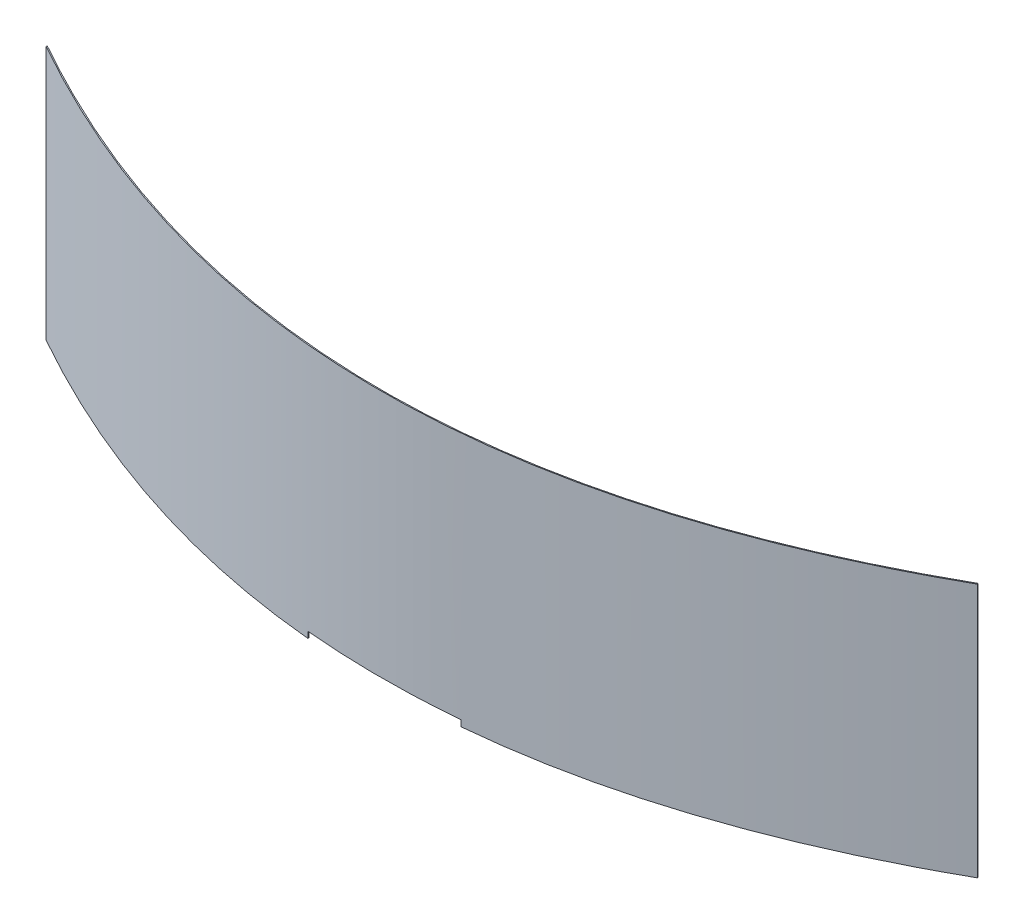
ISO-10303-21;
HEADER;
FILE_DESCRIPTION(('STEP AP214'),'2;1');
FILE_NAME('part.step','',(''),(''),'','','');
FILE_SCHEMA(('AUTOMOTIVE_DESIGN { 1 0 10303 214 1 1 1 1 }'));
ENDSEC;
DATA;
#1=APPLICATION_CONTEXT('core data for automotive mechanical design processes');
#2=APPLICATION_PROTOCOL_DEFINITION('international standard','automotive_design',2000,#1);
#3=PRODUCT_CONTEXT('',#1,'mechanical');
#4=PRODUCT('Part','Part','',(#3));
#5=PRODUCT_RELATED_PRODUCT_CATEGORY('part','',(#4));
#6=PRODUCT_DEFINITION_FORMATION('','',#4);
#7=PRODUCT_DEFINITION_CONTEXT('part definition',#1,'design');
#8=PRODUCT_DEFINITION('design','',#6,#7);
#9=PRODUCT_DEFINITION_SHAPE('','',#8);
#10=(LENGTH_UNIT() NAMED_UNIT(*) SI_UNIT(.MILLI.,.METRE.));
#11=(NAMED_UNIT(*) PLANE_ANGLE_UNIT() SI_UNIT($,.RADIAN.));
#12=(NAMED_UNIT(*) SI_UNIT($,.STERADIAN.) SOLID_ANGLE_UNIT());
#13=UNCERTAINTY_MEASURE_WITH_UNIT(LENGTH_MEASURE(1.E-05),#10,'distance_accuracy_value','');
#14=(GEOMETRIC_REPRESENTATION_CONTEXT(3) GLOBAL_UNCERTAINTY_ASSIGNED_CONTEXT((#13)) GLOBAL_UNIT_ASSIGNED_CONTEXT((#10,
#11,#12)) REPRESENTATION_CONTEXT('',''));
#15=CARTESIAN_POINT('',(0.,0.,0.));
#16=DIRECTION('',(0.,0.,1.));
#17=DIRECTION('',(1.,0.,0.));
#18=AXIS2_PLACEMENT_3D('',#15,#16,#17);
#19=CARTESIAN_POINT('',(28284.2712474619,123.,-999800.));
#20=CARTESIAN_POINT('',(0.,123.,1000200.));
#21=CARTESIAN_POINT('',(-28284.2712474619,123.,-999800.));
#22=B_SPLINE_CURVE_WITH_KNOTS('',2,(#19,#20,#21),.UNSPECIFIED.,.F.,.F.,(3,3),(0.,1.),.UNSPECIFIED.);
#23=DIRECTION('',(0.,-1.,0.));
#24=VECTOR('',#23,1.);
#25=SURFACE_OF_LINEAR_EXTRUSION('',#22,#24);
#26=DIRECTION('',(0.,-1.,0.));
#27=VECTOR('',#26,1.);
#28=CARTESIAN_POINT('',(-36.9999999999981,123.,198.288749999989));
#29=LINE('',#28,#27);
#30=CARTESIAN_POINT('',(-37.,0.,198.288749999989));
#31=VERTEX_POINT('',#30);
#32=CARTESIAN_POINT('',(-37.,3.00000000000002,198.288749999989));
#33=VERTEX_POINT('',#32);
#34=EDGE_CURVE('E190',#31,#33,#29,.F.);
#35=ORIENTED_EDGE('',*,*,#34,.F.);
#36=CARTESIAN_POINT('',(28284.2712474619,0.,-999800.));
#37=CARTESIAN_POINT('',(0.,0.,1000200.));
#38=CARTESIAN_POINT('',(-28284.2712474619,0.,-999800.));
#39=B_SPLINE_CURVE_WITH_KNOTS('',2,(#36,#37,#38),.UNSPECIFIED.,.F.,.F.,(3,3),(0.,1.),.UNSPECIFIED.);
#40=CARTESIAN_POINT('',(-225.000000000003,0.,136.718749999988));
#41=VERTEX_POINT('',#40);
#42=EDGE_CURVE('E175',#31,#41,#39,.T.);
#43=ORIENTED_EDGE('',*,*,#42,.T.);
#44=DIRECTION('',(0.,-1.,0.));
#45=VECTOR('',#44,1.);
#46=CARTESIAN_POINT('',(-225.000000000003,123.,136.718749999988));
#47=LINE('',#46,#45);
#48=CARTESIAN_POINT('',(-225.000000000003,123.,136.718749999988));
#49=VERTEX_POINT('',#48);
#50=EDGE_CURVE('E11',#49,#41,#47,.T.);
#51=ORIENTED_EDGE('',*,*,#50,.F.);
#52=CARTESIAN_POINT('',(224.999999999997,123.,136.718749999988));
#53=VERTEX_POINT('',#52);
#54=EDGE_CURVE('E159',#53,#49,#22,.T.);
#55=ORIENTED_EDGE('',*,*,#54,.F.);
#56=DIRECTION('',(0.,-1.,0.));
#57=VECTOR('',#56,1.);
#58=CARTESIAN_POINT('',(224.999999999997,123.,136.718749999988));
#59=LINE('',#58,#57);
#60=CARTESIAN_POINT('',(224.999999999997,0.,136.718749999988));
#61=VERTEX_POINT('',#60);
#62=EDGE_CURVE('E160',#53,#61,#59,.T.);
#63=ORIENTED_EDGE('',*,*,#62,.T.);
#64=CARTESIAN_POINT('',(36.9999999999999,0.,198.288749999989));
#65=VERTEX_POINT('',#64);
#66=EDGE_CURVE('E148',#61,#65,#39,.T.);
#67=ORIENTED_EDGE('',*,*,#66,.T.);
#68=DIRECTION('',(0.,-1.,0.));
#69=VECTOR('',#68,1.);
#70=CARTESIAN_POINT('',(37.0000000000035,123.,198.288749999988));
#71=LINE('',#70,#69);
#72=CARTESIAN_POINT('',(37.,3.00000000000003,198.288749999988));
#73=VERTEX_POINT('',#72);
#74=EDGE_CURVE('E62',#73,#65,#71,.T.);
#75=ORIENTED_EDGE('',*,*,#74,.F.);
#76=CARTESIAN_POINT('',(28284.2712474619,3.00000000000003,-999800.));
#77=CARTESIAN_POINT('',(0.,3.00000000000003,1000200.));
#78=CARTESIAN_POINT('',(-28284.2712474619,3.00000000000003,-999800.));
#79=B_SPLINE_CURVE_WITH_KNOTS('',2,(#76,#77,#78),.UNSPECIFIED.,.F.,.F.,(3,3),(0.,1.),.UNSPECIFIED.);
#80=EDGE_CURVE('E193',#33,#73,#79,.F.);
#81=ORIENTED_EDGE('',*,*,#80,.F.);
#82=EDGE_LOOP('',(#35,#43,#51,#55,#63,#67,#75,#81));
#83=FACE_BOUND('',#82,.T.);
#84=ADVANCED_FACE('F46',(#83),#25,.F.);
#85=CARTESIAN_POINT('',(-225.245130619819,123.,137.154537768551));
#86=CARTESIAN_POINT('',(-222.908176032963,123.,138.469074723657));
#87=CARTESIAN_POINT('',(-218.204067638301,123.,141.073902870022));
#88=CARTESIAN_POINT('',(-208.827276173067,123.,146.100944940152));
#89=CARTESIAN_POINT('',(-197.095113633908,123.,152.081763048424));
#90=CARTESIAN_POINT('',(-183.020628450954,123.,158.761564513527));
#91=CARTESIAN_POINT('',(-164.252323786066,123.,167.009400213228));
#92=CARTESIAN_POINT('',(-140.791197461168,123.,176.082259845335));
#93=CARTESIAN_POINT('',(-112.635650998168,123.,184.990896120192));
#94=CARTESIAN_POINT('',(-84.4784352769144,123.,191.920233494286));
#95=CARTESIAN_POINT('',(-46.9335816501066,123.,198.519950199364));
#96=CARTESIAN_POINT('',(-3.53883589099269E-13,123.,201.820033200405));
#97=CARTESIAN_POINT('',(46.9335816501035,123.,198.519950199365));
#98=CARTESIAN_POINT('',(84.4784352769108,123.,191.920233494286));
#99=CARTESIAN_POINT('',(112.635650998168,123.,184.990896120193));
#100=CARTESIAN_POINT('',(140.791197461162,123.,176.082259845337));
#101=CARTESIAN_POINT('',(164.252323786063,123.,167.009400213228));
#102=CARTESIAN_POINT('',(183.020628450953,123.,158.761564513527));
#103=CARTESIAN_POINT('',(197.0951136339,123.,152.081763048426));
#104=CARTESIAN_POINT('',(208.827276173062,123.,146.100944940152));
#105=CARTESIAN_POINT('',(218.204067638298,123.,141.073902870023));
#106=CARTESIAN_POINT('',(222.90817603296,123.,138.469074723659));
#107=CARTESIAN_POINT('',(225.245130619814,123.,137.154537768553));
#108=B_SPLINE_CURVE_WITH_KNOTS('',3,(#85,#86,#87,#88,#89,#90,#91,#92,#93,#94,#95,#96,#97,#98,
#99,#100,#101,#102,#103,#104,#105,#106,#107),.UNSPECIFIED.,.F.,.F.,(4,1,1,1,1,1,1,1,1,1,1,1,1,1,
1,1,1,1,1,1,4),(0.496022524355826,0.496146820469706,0.496271116583587,0.496519708811347,
0.496768301039108,0.497016893266869,0.497514077722391,0.498011262177913,0.498508446633435,
0.499005631088956,0.5,0.500994368911044,0.501491553366565,0.501988737822087,0.502485922277609,
0.502983106733131,0.503231698960892,0.503480291188652,0.503728883416413,0.503853179530294,
0.503977475644174),.UNSPECIFIED.);
#109=DIRECTION('',(0.,-1.,0.));
#110=VECTOR('',#109,1.);
#111=SURFACE_OF_LINEAR_EXTRUSION('',#108,#110);
#112=DIRECTION('',(0.,-1.,0.));
#113=VECTOR('',#112,1.);
#114=CARTESIAN_POINT('',(-37.0000000000017,123.,198.790876905931));
#115=LINE('',#114,#113);
#116=CARTESIAN_POINT('',(-37.,0.,198.790876905773));
#117=VERTEX_POINT('',#116);
#118=CARTESIAN_POINT('',(-37.0000000000017,3.00000000000003,198.790876905931));
#119=VERTEX_POINT('',#118);
#120=EDGE_CURVE('E242',#117,#119,#115,.F.);
#121=ORIENTED_EDGE('',*,*,#120,.T.);
#122=CARTESIAN_POINT('',(-225.245130619819,3.00000000000003,137.154537768551));
#123=CARTESIAN_POINT('',(-222.908176032963,3.00000000000003,138.469074723657));
#124=CARTESIAN_POINT('',(-218.204067638301,3.00000000000003,141.073902870022));
#125=CARTESIAN_POINT('',(-208.827276173067,3.00000000000003,146.100944940152));
#126=CARTESIAN_POINT('',(-197.095113633908,3.00000000000003,152.081763048424));
#127=CARTESIAN_POINT('',(-183.020628450954,3.00000000000003,158.761564513527));
#128=CARTESIAN_POINT('',(-164.252323786066,3.00000000000003,167.009400213228));
#129=CARTESIAN_POINT('',(-140.791197461168,3.00000000000003,176.082259845335));
#130=CARTESIAN_POINT('',(-112.635650998168,3.00000000000003,184.990896120192));
#131=CARTESIAN_POINT('',(-84.4784352769144,3.00000000000003,191.920233494286));
#132=CARTESIAN_POINT('',(-46.9335816501066,3.00000000000003,198.519950199364));
#133=CARTESIAN_POINT('',(-3.53883589099269E-13,3.00000000000003,201.820033200405));
#134=CARTESIAN_POINT('',(46.9335816501035,3.00000000000003,198.519950199365));
#135=CARTESIAN_POINT('',(84.4784352769108,3.00000000000003,191.920233494286));
#136=CARTESIAN_POINT('',(112.635650998168,3.00000000000003,184.990896120193));
#137=CARTESIAN_POINT('',(140.791197461162,3.00000000000003,176.082259845337));
#138=CARTESIAN_POINT('',(164.252323786063,3.00000000000003,167.009400213228));
#139=CARTESIAN_POINT('',(183.020628450953,3.00000000000003,158.761564513527));
#140=CARTESIAN_POINT('',(197.0951136339,3.00000000000003,152.081763048426));
#141=CARTESIAN_POINT('',(208.827276173062,3.00000000000003,146.100944940152));
#142=CARTESIAN_POINT('',(218.204067638298,3.00000000000003,141.073902870023));
#143=CARTESIAN_POINT('',(222.90817603296,3.00000000000003,138.469074723659));
#144=CARTESIAN_POINT('',(225.245130619814,3.00000000000003,137.154537768553));
#145=B_SPLINE_CURVE_WITH_KNOTS('',3,(#122,#123,#124,#125,#126,#127,#128,#129,#130,#131,#132,
#133,#134,#135,#136,#137,#138,#139,#140,#141,#142,#143,#144),.UNSPECIFIED.,.F.,.F.,(4,1,1,1,1,1,
1,1,1,1,1,1,1,1,1,1,1,1,1,1,4),(0.496022524355826,0.496146820469706,0.496271116583587,
0.496519708811347,0.496768301039108,0.497016893266869,0.497514077722391,0.498011262177913,
0.498508446633435,0.499005631088956,0.5,0.500994368911044,0.501491553366565,0.501988737822087,
0.502485922277609,0.502983106733131,0.503231698960892,0.503480291188652,0.503728883416413,
0.503853179530294,0.503977475644174),.UNSPECIFIED.);
#146=CARTESIAN_POINT('',(37.0000000000007,3.00000000000003,198.790876905932));
#147=VERTEX_POINT('',#146);
#148=EDGE_CURVE('E137',#119,#147,#145,.T.);
#149=ORIENTED_EDGE('',*,*,#148,.T.);
#150=DIRECTION('',(0.,-1.,0.));
#151=VECTOR('',#150,1.);
#152=CARTESIAN_POINT('',(37.0000000000007,123.,198.790876905932));
#153=LINE('',#152,#151);
#154=CARTESIAN_POINT('',(36.9999999999944,0.,198.790876905932));
#155=VERTEX_POINT('',#154);
#156=EDGE_CURVE('E122',#147,#155,#153,.T.);
#157=ORIENTED_EDGE('',*,*,#156,.T.);
#158=CARTESIAN_POINT('',(-225.245130619819,0.,137.154537768551));
#159=CARTESIAN_POINT('',(-222.908176032963,0.,138.469074723657));
#160=CARTESIAN_POINT('',(-218.204067638301,0.,141.073902870022));
#161=CARTESIAN_POINT('',(-208.827276173067,0.,146.100944940152));
#162=CARTESIAN_POINT('',(-197.095113633908,0.,152.081763048424));
#163=CARTESIAN_POINT('',(-183.020628450954,0.,158.761564513527));
#164=CARTESIAN_POINT('',(-164.252323786066,0.,167.009400213228));
#165=CARTESIAN_POINT('',(-140.791197461168,0.,176.082259845335));
#166=CARTESIAN_POINT('',(-112.635650998168,0.,184.990896120192));
#167=CARTESIAN_POINT('',(-84.4784352769144,0.,191.920233494286));
#168=CARTESIAN_POINT('',(-46.9335816501066,0.,198.519950199364));
#169=CARTESIAN_POINT('',(-3.53883589099269E-13,0.,201.820033200405));
#170=CARTESIAN_POINT('',(46.9335816501035,0.,198.519950199365));
#171=CARTESIAN_POINT('',(84.4784352769108,0.,191.920233494286));
#172=CARTESIAN_POINT('',(112.635650998168,0.,184.990896120193));
#173=CARTESIAN_POINT('',(140.791197461162,0.,176.082259845337));
#174=CARTESIAN_POINT('',(164.252323786063,0.,167.009400213228));
#175=CARTESIAN_POINT('',(183.020628450953,0.,158.761564513527));
#176=CARTESIAN_POINT('',(197.0951136339,0.,152.081763048426));
#177=CARTESIAN_POINT('',(208.827276173062,0.,146.100944940152));
#178=CARTESIAN_POINT('',(218.204067638298,0.,141.073902870023));
#179=CARTESIAN_POINT('',(222.90817603296,0.,138.469074723659));
#180=CARTESIAN_POINT('',(225.245130619814,0.,137.154537768553));
#181=B_SPLINE_CURVE_WITH_KNOTS('',3,(#158,#159,#160,#161,#162,#163,#164,#165,#166,#167,#168,
#169,#170,#171,#172,#173,#174,#175,#176,#177,#178,#179,#180),.UNSPECIFIED.,.F.,.F.,(4,1,1,1,1,1,
1,1,1,1,1,1,1,1,1,1,1,1,1,1,4),(0.496022524355826,0.496146820469706,0.496271116583587,
0.496519708811347,0.496768301039108,0.497016893266869,0.497514077722391,0.498011262177913,
0.498508446633435,0.499005631088956,0.5,0.500994368911044,0.501491553366565,0.501988737822087,
0.502485922277609,0.502983106733131,0.503231698960892,0.503480291188652,0.503728883416413,
0.503853179530294,0.503977475644174),.UNSPECIFIED.);
#182=CARTESIAN_POINT('',(225.245130619814,0.,137.154537768553));
#183=VERTEX_POINT('',#182);
#184=EDGE_CURVE('E136',#155,#183,#181,.T.);
#185=ORIENTED_EDGE('',*,*,#184,.T.);
#186=DIRECTION('',(0.,-1.,0.));
#187=VECTOR('',#186,1.);
#188=CARTESIAN_POINT('',(225.245130619814,123.,137.154537768553));
#189=LINE('',#188,#187);
#190=CARTESIAN_POINT('',(225.245130619814,123.,137.154537768553));
#191=VERTEX_POINT('',#190);
#192=EDGE_CURVE('E163',#191,#183,#189,.T.);
#193=ORIENTED_EDGE('',*,*,#192,.F.);
#194=CARTESIAN_POINT('',(-225.245130619819,123.,137.154537768551));
#195=VERTEX_POINT('',#194);
#196=EDGE_CURVE('E169',#195,#191,#108,.T.);
#197=ORIENTED_EDGE('',*,*,#196,.F.);
#198=DIRECTION('',(0.,-1.,0.));
#199=VECTOR('',#198,1.);
#200=CARTESIAN_POINT('',(-225.245130619819,123.,137.154537768551));
#201=LINE('',#200,#199);
#202=CARTESIAN_POINT('',(-225.245130619819,0.,137.154537768551));
#203=VERTEX_POINT('',#202);
#204=EDGE_CURVE('E55',#195,#203,#201,.T.);
#205=ORIENTED_EDGE('',*,*,#204,.T.);
#206=EDGE_CURVE('E142',#203,#117,#181,.T.);
#207=ORIENTED_EDGE('',*,*,#206,.T.);
#208=EDGE_LOOP('',(#121,#149,#157,#185,#193,#197,#205,#207));
#209=FACE_BOUND('',#208,.T.);
#210=ADVANCED_FACE('F134',(#209),#111,.F.);
#211=CARTESIAN_POINT('',(0.,0.,199.999999999989));
#212=DIRECTION('',(0.,-1.,0.));
#213=DIRECTION('',(0.,0.,-1.));
#214=AXIS2_PLACEMENT_3D('',#211,#212,#213);
#215=PLANE('',#214);
#216=ORIENTED_EDGE('',*,*,#42,.F.);
#217=DIRECTION('',(0.,0.,-1.));
#218=VECTOR('',#217,1.);
#219=CARTESIAN_POINT('',(-37.,0.,201.821033200405));
#220=LINE('',#219,#218);
#221=EDGE_CURVE('E129',#117,#31,#220,.T.);
#222=ORIENTED_EDGE('',*,*,#221,.F.);
#223=ORIENTED_EDGE('',*,*,#206,.F.);
#224=DIRECTION('',(-0.490261239632588,0.,0.871575537124533));
#225=VECTOR('',#224,1.);
#226=CARTESIAN_POINT('',(-225.000000000003,0.,136.718749999988));
#227=LINE('',#226,#225);
#228=EDGE_CURVE('E143',#41,#203,#227,.T.);
#229=ORIENTED_EDGE('',*,*,#228,.F.);
#230=EDGE_LOOP('',(#216,#222,#223,#229));
#231=FACE_BOUND('',#230,.T.);
#232=ADVANCED_FACE('F174',(#231),#215,.T.);
#233=ORIENTED_EDGE('',*,*,#184,.F.);
#234=DIRECTION('',(0.,0.,-1.));
#235=VECTOR('',#234,1.);
#236=CARTESIAN_POINT('',(37.,0.,201.821033200405));
#237=LINE('',#236,#235);
#238=EDGE_CURVE('E119',#155,#65,#237,.T.);
#239=ORIENTED_EDGE('',*,*,#238,.T.);
#240=ORIENTED_EDGE('',*,*,#66,.F.);
#241=DIRECTION('',(-0.490261239632251,0.,-0.871575537124723));
#242=VECTOR('',#241,1.);
#243=CARTESIAN_POINT('',(225.245130619814,0.,137.154537768553));
#244=LINE('',#243,#242);
#245=EDGE_CURVE('E92',#183,#61,#244,.T.);
#246=ORIENTED_EDGE('',*,*,#245,.F.);
#247=EDGE_LOOP('',(#233,#239,#240,#246));
#248=FACE_BOUND('',#247,.T.);
#249=ADVANCED_FACE('F140',(#248),#215,.T.);
#250=CARTESIAN_POINT('',(-225.000000000003,123.,136.718749999988));
#251=DIRECTION('',(0.871575537124533,0.,0.490261239632588));
#252=DIRECTION('',(0.490261239632588,0.,-0.871575537124533));
#253=AXIS2_PLACEMENT_3D('',#250,#251,#252);
#254=PLANE('',#253);
#255=ORIENTED_EDGE('',*,*,#228,.T.);
#256=ORIENTED_EDGE('',*,*,#204,.F.);
#257=DIRECTION('',(-0.490261239632588,0.,0.871575537124533));
#258=VECTOR('',#257,1.);
#259=CARTESIAN_POINT('',(-225.000000000003,123.,136.718749999988));
#260=LINE('',#259,#258);
#261=EDGE_CURVE('E99',#49,#195,#260,.T.);
#262=ORIENTED_EDGE('',*,*,#261,.F.);
#263=ORIENTED_EDGE('',*,*,#50,.T.);
#264=EDGE_LOOP('',(#255,#256,#262,#263));
#265=FACE_BOUND('',#264,.T.);
#266=ADVANCED_FACE('F223',(#265),#254,.F.);
#267=CARTESIAN_POINT('',(225.245130619814,123.,137.154537768553));
#268=DIRECTION('',(-0.871575537124723,0.,0.490261239632251));
#269=DIRECTION('',(0.490261239632251,0.,0.871575537124723));
#270=AXIS2_PLACEMENT_3D('',#267,#268,#269);
#271=PLANE('',#270);
#272=ORIENTED_EDGE('',*,*,#245,.T.);
#273=ORIENTED_EDGE('',*,*,#62,.F.);
#274=DIRECTION('',(-0.490261239632251,0.,-0.871575537124723));
#275=VECTOR('',#274,1.);
#276=CARTESIAN_POINT('',(225.245130619814,123.,137.154537768553));
#277=LINE('',#276,#275);
#278=EDGE_CURVE('E71',#191,#53,#277,.T.);
#279=ORIENTED_EDGE('',*,*,#278,.F.);
#280=ORIENTED_EDGE('',*,*,#192,.T.);
#281=EDGE_LOOP('',(#272,#273,#279,#280));
#282=FACE_BOUND('',#281,.T.);
#283=ADVANCED_FACE('F221',(#282),#271,.F.);
#284=CARTESIAN_POINT('',(0.,123.,199.999999999989));
#285=DIRECTION('',(0.,-1.,0.));
#286=DIRECTION('',(0.,0.,-1.));
#287=AXIS2_PLACEMENT_3D('',#284,#285,#286);
#288=PLANE('',#287);
#289=ORIENTED_EDGE('',*,*,#54,.T.);
#290=ORIENTED_EDGE('',*,*,#261,.T.);
#291=ORIENTED_EDGE('',*,*,#196,.T.);
#292=ORIENTED_EDGE('',*,*,#278,.T.);
#293=EDGE_LOOP('',(#289,#290,#291,#292));
#294=FACE_BOUND('',#293,.T.);
#295=ADVANCED_FACE('F228',(#294),#288,.F.);
#296=CARTESIAN_POINT('',(37.,3.00000000000003,201.821033200405));
#297=DIRECTION('',(0.,-1.,0.));
#298=DIRECTION('',(1.,0.,0.));
#299=AXIS2_PLACEMENT_3D('',#296,#297,#298);
#300=PLANE('',#299);
#301=ORIENTED_EDGE('',*,*,#80,.T.);
#302=DIRECTION('',(0.,0.,-1.));
#303=VECTOR('',#302,1.);
#304=CARTESIAN_POINT('',(37.,3.00000000000003,201.821033200405));
#305=LINE('',#304,#303);
#306=EDGE_CURVE('E183',#147,#73,#305,.T.);
#307=ORIENTED_EDGE('',*,*,#306,.F.);
#308=ORIENTED_EDGE('',*,*,#148,.F.);
#309=DIRECTION('',(0.,0.,-1.));
#310=VECTOR('',#309,1.);
#311=CARTESIAN_POINT('',(-37.,3.00000000000002,201.821033200405));
#312=LINE('',#311,#310);
#313=EDGE_CURVE('E179',#119,#33,#312,.T.);
#314=ORIENTED_EDGE('',*,*,#313,.T.);
#315=EDGE_LOOP('',(#301,#307,#308,#314));
#316=FACE_BOUND('',#315,.T.);
#317=ADVANCED_FACE('F240',(#316),#300,.T.);
#318=CARTESIAN_POINT('',(-37.,3.00000000000002,201.821033200405));
#319=DIRECTION('',(1.,0.,0.));
#320=DIRECTION('',(0.,1.,0.));
#321=AXIS2_PLACEMENT_3D('',#318,#319,#320);
#322=PLANE('',#321);
#323=ORIENTED_EDGE('',*,*,#34,.T.);
#324=ORIENTED_EDGE('',*,*,#313,.F.);
#325=ORIENTED_EDGE('',*,*,#120,.F.);
#326=ORIENTED_EDGE('',*,*,#221,.T.);
#327=EDGE_LOOP('',(#323,#324,#325,#326));
#328=FACE_BOUND('',#327,.T.);
#329=ADVANCED_FACE('F238',(#328),#322,.T.);
#330=CARTESIAN_POINT('',(37.,3.00000000000003,201.821033200405));
#331=DIRECTION('',(-1.,0.,0.));
#332=DIRECTION('',(0.,-1.,0.));
#333=AXIS2_PLACEMENT_3D('',#330,#331,#332);
#334=PLANE('',#333);
#335=ORIENTED_EDGE('',*,*,#74,.T.);
#336=ORIENTED_EDGE('',*,*,#238,.F.);
#337=ORIENTED_EDGE('',*,*,#156,.F.);
#338=ORIENTED_EDGE('',*,*,#306,.T.);
#339=EDGE_LOOP('',(#335,#336,#337,#338));
#340=FACE_BOUND('',#339,.T.);
#341=ADVANCED_FACE('F121',(#340),#334,.T.);
#342=CLOSED_SHELL('',(#84,#210,#232,#249,#266,#283,#295,#317,#329,#341));
#343=MANIFOLD_SOLID_BREP('B2',#342);
#344=ADVANCED_BREP_SHAPE_REPRESENTATION('',(#18,#343),#14);
#345=SHAPE_DEFINITION_REPRESENTATION(#9,#344);
ENDSEC;
END-ISO-10303-21;
